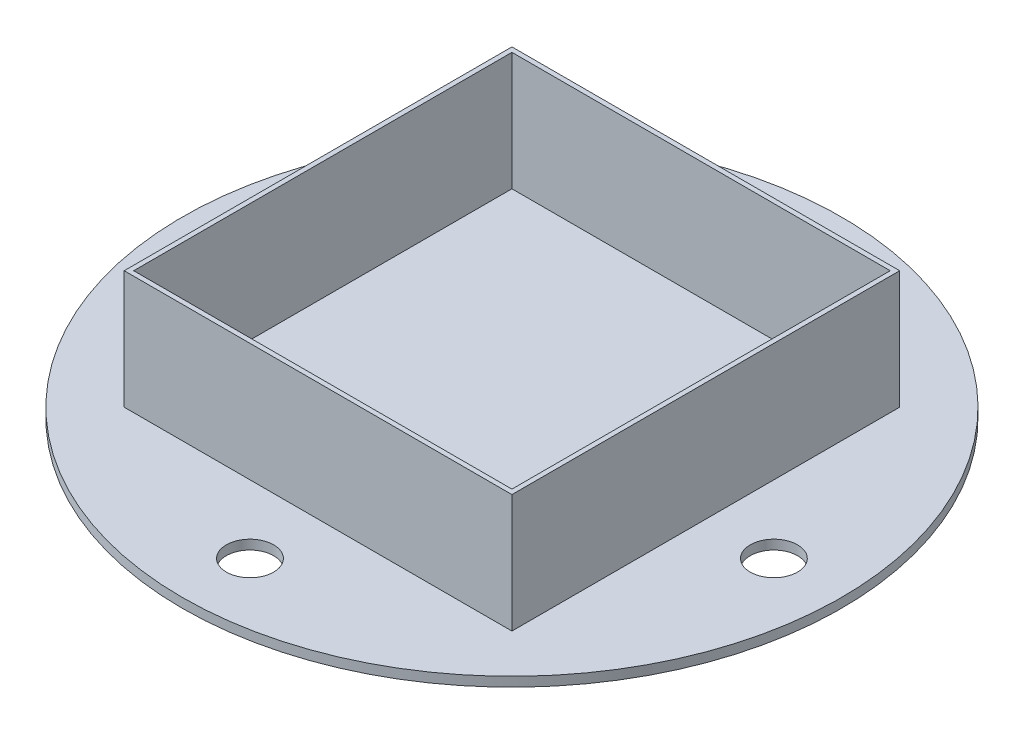
ISO-10303-21;
HEADER;
FILE_DESCRIPTION(('STEP AP214'),'2;1');
FILE_NAME('part.step','',(''),(''),'','','');
FILE_SCHEMA(('AUTOMOTIVE_DESIGN { 1 0 10303 214 1 1 1 1 }'));
ENDSEC;
DATA;
#1=APPLICATION_CONTEXT('core data for automotive mechanical design processes');
#2=APPLICATION_PROTOCOL_DEFINITION('international standard','automotive_design',2000,#1);
#3=PRODUCT_CONTEXT('',#1,'mechanical');
#4=PRODUCT('Part','Part','',(#3));
#5=PRODUCT_RELATED_PRODUCT_CATEGORY('part','',(#4));
#6=PRODUCT_DEFINITION_FORMATION('','',#4);
#7=PRODUCT_DEFINITION_CONTEXT('part definition',#1,'design');
#8=PRODUCT_DEFINITION('design','',#6,#7);
#9=PRODUCT_DEFINITION_SHAPE('','',#8);
#10=(LENGTH_UNIT() NAMED_UNIT(*) SI_UNIT(.MILLI.,.METRE.));
#11=(NAMED_UNIT(*) PLANE_ANGLE_UNIT() SI_UNIT($,.RADIAN.));
#12=(NAMED_UNIT(*) SI_UNIT($,.STERADIAN.) SOLID_ANGLE_UNIT());
#13=UNCERTAINTY_MEASURE_WITH_UNIT(LENGTH_MEASURE(1.E-05),#10,'distance_accuracy_value','');
#14=(GEOMETRIC_REPRESENTATION_CONTEXT(3) GLOBAL_UNCERTAINTY_ASSIGNED_CONTEXT((#13)) GLOBAL_UNIT_ASSIGNED_CONTEXT((#10,
#11,#12)) REPRESENTATION_CONTEXT('',''));
#15=CARTESIAN_POINT('',(0.,0.,0.));
#16=DIRECTION('',(0.,0.,1.));
#17=DIRECTION('',(1.,0.,0.));
#18=AXIS2_PLACEMENT_3D('',#15,#16,#17);
#19=CARTESIAN_POINT('',(0.,2.54,0.));
#20=DIRECTION('',(0.,1.,0.));
#21=DIRECTION('',(0.,0.,1.));
#22=AXIS2_PLACEMENT_3D('',#19,#20,#21);
#23=PLANE('',#22);
#24=CARTESIAN_POINT('',(0.,2.54,-70.4215));
#25=DIRECTION('',(0.,1.,0.));
#26=DIRECTION('',(0.,0.,1.));
#27=AXIS2_PLACEMENT_3D('',#24,#25,#26);
#28=CIRCLE('',#27,6.35);
#29=CARTESIAN_POINT('',(0.,2.54,-64.0715));
#30=VERTEX_POINT('',#29);
#31=EDGE_CURVE('E379',#30,#30,#28,.T.);
#32=ORIENTED_EDGE('',*,*,#31,.F.);
#33=EDGE_LOOP('',(#32));
#34=FACE_BOUND('',#33,.T.);
#35=CARTESIAN_POINT('',(0.,2.54,70.358));
#36=DIRECTION('',(0.,1.,0.));
#37=DIRECTION('',(0.,0.,1.));
#38=AXIS2_PLACEMENT_3D('',#35,#36,#37);
#39=CIRCLE('',#38,6.35);
#40=CARTESIAN_POINT('',(0.,2.54,76.708));
#41=VERTEX_POINT('',#40);
#42=EDGE_CURVE('E381',#41,#41,#39,.T.);
#43=ORIENTED_EDGE('',*,*,#42,.F.);
#44=EDGE_LOOP('',(#43));
#45=FACE_BOUND('',#44,.T.);
#46=CARTESIAN_POINT('',(70.358,2.54,0.));
#47=DIRECTION('',(0.,1.,0.));
#48=DIRECTION('',(0.,0.,1.));
#49=AXIS2_PLACEMENT_3D('',#46,#47,#48);
#50=CIRCLE('',#49,6.35);
#51=CARTESIAN_POINT('',(70.358,2.54,6.35));
#52=VERTEX_POINT('',#51);
#53=EDGE_CURVE('E393',#52,#52,#50,.T.);
#54=ORIENTED_EDGE('',*,*,#53,.F.);
#55=EDGE_LOOP('',(#54));
#56=FACE_BOUND('',#55,.T.);
#57=CARTESIAN_POINT('',(-70.358,2.54,0.));
#58=DIRECTION('',(0.,1.,0.));
#59=DIRECTION('',(0.,0.,1.));
#60=AXIS2_PLACEMENT_3D('',#57,#58,#59);
#61=CIRCLE('',#60,6.35);
#62=CARTESIAN_POINT('',(-70.358,2.54,6.35));
#63=VERTEX_POINT('',#62);
#64=EDGE_CURVE('E401',#63,#63,#61,.T.);
#65=ORIENTED_EDGE('',*,*,#64,.F.);
#66=EDGE_LOOP('',(#65));
#67=FACE_BOUND('',#66,.T.);
#68=CARTESIAN_POINT('',(0.,2.54,0.));
#69=DIRECTION('',(0.,1.,0.));
#70=DIRECTION('',(0.,0.,1.));
#71=AXIS2_PLACEMENT_3D('',#68,#69,#70);
#72=CIRCLE('',#71,88.519);
#73=CARTESIAN_POINT('',(0.,2.54,88.519));
#74=VERTEX_POINT('',#73);
#75=EDGE_CURVE('E12',#74,#74,#72,.T.);
#76=ORIENTED_EDGE('',*,*,#75,.T.);
#77=EDGE_LOOP('',(#76));
#78=FACE_BOUND('',#77,.T.);
#79=DIRECTION('',(0.,0.,1.));
#80=VECTOR('',#79,1.);
#81=CARTESIAN_POINT('',(52.07,2.54,-52.07));
#82=LINE('',#81,#80);
#83=CARTESIAN_POINT('',(52.07,2.54,-52.07));
#84=VERTEX_POINT('',#83);
#85=CARTESIAN_POINT('',(52.07,2.54,52.07));
#86=VERTEX_POINT('',#85);
#87=EDGE_CURVE('E207',#84,#86,#82,.T.);
#88=ORIENTED_EDGE('',*,*,#87,.T.);
#89=DIRECTION('',(1.,0.,0.));
#90=VECTOR('',#89,1.);
#91=CARTESIAN_POINT('',(-52.07,2.54,52.07));
#92=LINE('',#91,#90);
#93=CARTESIAN_POINT('',(-52.07,2.54,52.07));
#94=VERTEX_POINT('',#93);
#95=EDGE_CURVE('E155',#94,#86,#92,.T.);
#96=ORIENTED_EDGE('',*,*,#95,.F.);
#97=DIRECTION('',(0.,0.,1.));
#98=VECTOR('',#97,1.);
#99=CARTESIAN_POINT('',(-52.07,2.54,-52.07));
#100=LINE('',#99,#98);
#101=CARTESIAN_POINT('',(-52.07,2.54,-52.07));
#102=VERTEX_POINT('',#101);
#103=EDGE_CURVE('E192',#102,#94,#100,.T.);
#104=ORIENTED_EDGE('',*,*,#103,.F.);
#105=DIRECTION('',(1.,0.,0.));
#106=VECTOR('',#105,1.);
#107=CARTESIAN_POINT('',(-52.07,2.54,-52.07));
#108=LINE('',#107,#106);
#109=EDGE_CURVE('E84',#102,#84,#108,.T.);
#110=ORIENTED_EDGE('',*,*,#109,.T.);
#111=EDGE_LOOP('',(#88,#96,#104,#110));
#112=FACE_BOUND('',#111,.T.);
#113=ADVANCED_FACE('F68',(#34,#45,#56,#67,#78,#112),#23,.T.);
#114=CARTESIAN_POINT('',(0.,2.54,0.));
#115=DIRECTION('',(0.,-1.,0.));
#116=DIRECTION('',(0.,0.,-1.));
#117=AXIS2_PLACEMENT_3D('',#114,#115,#116);
#118=CYLINDRICAL_SURFACE('',#117,88.519);
#119=ORIENTED_EDGE('',*,*,#75,.F.);
#120=EDGE_LOOP('',(#119));
#121=FACE_BOUND('',#120,.T.);
#122=CARTESIAN_POINT('',(0.,0.,0.));
#123=DIRECTION('',(0.,1.,0.));
#124=DIRECTION('',(0.,0.,1.));
#125=AXIS2_PLACEMENT_3D('',#122,#123,#124);
#126=CIRCLE('',#125,88.519);
#127=CARTESIAN_POINT('',(0.,0.,88.519));
#128=VERTEX_POINT('',#127);
#129=EDGE_CURVE('E72',#128,#128,#126,.T.);
#130=ORIENTED_EDGE('',*,*,#129,.T.);
#131=EDGE_LOOP('',(#130));
#132=FACE_BOUND('',#131,.T.);
#133=ADVANCED_FACE('F70',(#121,#132),#118,.T.);
#134=CARTESIAN_POINT('',(0.,0.,0.));
#135=DIRECTION('',(0.,1.,0.));
#136=DIRECTION('',(0.,0.,1.));
#137=AXIS2_PLACEMENT_3D('',#134,#135,#136);
#138=PLANE('',#137);
#139=CARTESIAN_POINT('',(0.,0.,-70.4215));
#140=DIRECTION('',(0.,1.,0.));
#141=DIRECTION('',(0.,0.,1.));
#142=AXIS2_PLACEMENT_3D('',#139,#140,#141);
#143=CIRCLE('',#142,6.35);
#144=CARTESIAN_POINT('',(0.,0.,-64.0715));
#145=VERTEX_POINT('',#144);
#146=EDGE_CURVE('E171',#145,#145,#143,.T.);
#147=ORIENTED_EDGE('',*,*,#146,.T.);
#148=EDGE_LOOP('',(#147));
#149=FACE_BOUND('',#148,.T.);
#150=CARTESIAN_POINT('',(0.,0.,70.358));
#151=DIRECTION('',(0.,1.,0.));
#152=DIRECTION('',(0.,0.,1.));
#153=AXIS2_PLACEMENT_3D('',#150,#151,#152);
#154=CIRCLE('',#153,6.35);
#155=CARTESIAN_POINT('',(0.,0.,76.708));
#156=VERTEX_POINT('',#155);
#157=EDGE_CURVE('E387',#156,#156,#154,.T.);
#158=ORIENTED_EDGE('',*,*,#157,.T.);
#159=EDGE_LOOP('',(#158));
#160=FACE_BOUND('',#159,.T.);
#161=CARTESIAN_POINT('',(70.358,0.,0.));
#162=DIRECTION('',(0.,1.,0.));
#163=DIRECTION('',(0.,0.,1.));
#164=AXIS2_PLACEMENT_3D('',#161,#162,#163);
#165=CIRCLE('',#164,6.35);
#166=CARTESIAN_POINT('',(70.358,0.,6.35));
#167=VERTEX_POINT('',#166);
#168=EDGE_CURVE('E397',#167,#167,#165,.T.);
#169=ORIENTED_EDGE('',*,*,#168,.T.);
#170=EDGE_LOOP('',(#169));
#171=FACE_BOUND('',#170,.T.);
#172=CARTESIAN_POINT('',(-70.358,0.,0.));
#173=DIRECTION('',(0.,1.,0.));
#174=DIRECTION('',(0.,0.,1.));
#175=AXIS2_PLACEMENT_3D('',#172,#173,#174);
#176=CIRCLE('',#175,6.35);
#177=CARTESIAN_POINT('',(-70.358,0.,6.35));
#178=VERTEX_POINT('',#177);
#179=EDGE_CURVE('E404',#178,#178,#176,.T.);
#180=ORIENTED_EDGE('',*,*,#179,.T.);
#181=EDGE_LOOP('',(#180));
#182=FACE_BOUND('',#181,.T.);
#183=ORIENTED_EDGE('',*,*,#129,.F.);
#184=EDGE_LOOP('',(#183));
#185=FACE_BOUND('',#184,.T.);
#186=ADVANCED_FACE('F234',(#149,#160,#171,#182,#185),#138,.F.);
#187=CARTESIAN_POINT('',(0.,34.29,0.));
#188=DIRECTION('',(0.,-1.,0.));
#189=DIRECTION('',(0.,0.,-1.));
#190=AXIS2_PLACEMENT_3D('',#187,#188,#189);
#191=PLANE('',#190);
#192=DIRECTION('',(1.,0.,0.));
#193=VECTOR('',#192,1.);
#194=CARTESIAN_POINT('',(-52.07,34.29,52.07));
#195=LINE('',#194,#193);
#196=CARTESIAN_POINT('',(-52.07,34.29,52.07));
#197=VERTEX_POINT('',#196);
#198=CARTESIAN_POINT('',(52.07,34.29,52.07));
#199=VERTEX_POINT('',#198);
#200=EDGE_CURVE('E188',#197,#199,#195,.T.);
#201=ORIENTED_EDGE('',*,*,#200,.T.);
#202=DIRECTION('',(0.,0.,1.));
#203=VECTOR('',#202,1.);
#204=CARTESIAN_POINT('',(52.07,34.29,-52.07));
#205=LINE('',#204,#203);
#206=CARTESIAN_POINT('',(52.07,34.29,-52.07));
#207=VERTEX_POINT('',#206);
#208=EDGE_CURVE('E191',#207,#199,#205,.T.);
#209=ORIENTED_EDGE('',*,*,#208,.F.);
#210=DIRECTION('',(1.,0.,0.));
#211=VECTOR('',#210,1.);
#212=CARTESIAN_POINT('',(-52.07,34.29,-52.07));
#213=LINE('',#212,#211);
#214=CARTESIAN_POINT('',(-52.07,34.29,-52.07));
#215=VERTEX_POINT('',#214);
#216=EDGE_CURVE('E196',#215,#207,#213,.T.);
#217=ORIENTED_EDGE('',*,*,#216,.F.);
#218=DIRECTION('',(0.,0.,1.));
#219=VECTOR('',#218,1.);
#220=CARTESIAN_POINT('',(-52.07,34.29,-52.07));
#221=LINE('',#220,#219);
#222=EDGE_CURVE('E200',#215,#197,#221,.T.);
#223=ORIENTED_EDGE('',*,*,#222,.T.);
#224=EDGE_LOOP('',(#201,#209,#217,#223));
#225=FACE_BOUND('',#224,.T.);
#226=DIRECTION('',(1.,0.,0.));
#227=VECTOR('',#226,1.);
#228=CARTESIAN_POINT('',(-50.8,34.29,50.8));
#229=LINE('',#228,#227);
#230=CARTESIAN_POINT('',(-50.8,34.29,50.8));
#231=VERTEX_POINT('',#230);
#232=CARTESIAN_POINT('',(50.8,34.29,50.8));
#233=VERTEX_POINT('',#232);
#234=EDGE_CURVE('E134',#231,#233,#229,.T.);
#235=ORIENTED_EDGE('',*,*,#234,.F.);
#236=DIRECTION('',(0.,0.,1.));
#237=VECTOR('',#236,1.);
#238=CARTESIAN_POINT('',(-50.8,34.29,-50.8));
#239=LINE('',#238,#237);
#240=CARTESIAN_POINT('',(-50.8,34.29,-50.8));
#241=VERTEX_POINT('',#240);
#242=EDGE_CURVE('E163',#241,#231,#239,.T.);
#243=ORIENTED_EDGE('',*,*,#242,.F.);
#244=DIRECTION('',(1.,0.,0.));
#245=VECTOR('',#244,1.);
#246=CARTESIAN_POINT('',(-50.8,34.29,-50.8));
#247=LINE('',#246,#245);
#248=CARTESIAN_POINT('',(50.8,34.29,-50.8));
#249=VERTEX_POINT('',#248);
#250=EDGE_CURVE('E159',#241,#249,#247,.T.);
#251=ORIENTED_EDGE('',*,*,#250,.T.);
#252=DIRECTION('',(0.,0.,1.));
#253=VECTOR('',#252,1.);
#254=CARTESIAN_POINT('',(50.8,34.29,-50.8));
#255=LINE('',#254,#253);
#256=EDGE_CURVE('E145',#249,#233,#255,.T.);
#257=ORIENTED_EDGE('',*,*,#256,.T.);
#258=EDGE_LOOP('',(#235,#243,#251,#257));
#259=FACE_BOUND('',#258,.T.);
#260=ADVANCED_FACE('F158',(#225,#259),#191,.F.);
#261=CARTESIAN_POINT('',(-52.07,34.29,52.07));
#262=DIRECTION('',(0.,0.,-1.));
#263=DIRECTION('',(-1.,0.,0.));
#264=AXIS2_PLACEMENT_3D('',#261,#262,#263);
#265=PLANE('',#264);
#266=ORIENTED_EDGE('',*,*,#95,.T.);
#267=DIRECTION('',(0.,-1.,0.));
#268=VECTOR('',#267,1.);
#269=CARTESIAN_POINT('',(52.07,34.29,52.07));
#270=LINE('',#269,#268);
#271=EDGE_CURVE('E224',#199,#86,#270,.T.);
#272=ORIENTED_EDGE('',*,*,#271,.F.);
#273=ORIENTED_EDGE('',*,*,#200,.F.);
#274=DIRECTION('',(0.,-1.,0.));
#275=VECTOR('',#274,1.);
#276=CARTESIAN_POINT('',(-52.07,34.29,52.07));
#277=LINE('',#276,#275);
#278=EDGE_CURVE('E203',#197,#94,#277,.T.);
#279=ORIENTED_EDGE('',*,*,#278,.T.);
#280=EDGE_LOOP('',(#266,#272,#273,#279));
#281=FACE_BOUND('',#280,.T.);
#282=ADVANCED_FACE('F242',(#281),#265,.F.);
#283=CARTESIAN_POINT('',(52.07,34.29,-52.07));
#284=DIRECTION('',(1.,0.,0.));
#285=DIRECTION('',(0.,0.,-1.));
#286=AXIS2_PLACEMENT_3D('',#283,#284,#285);
#287=PLANE('',#286);
#288=ORIENTED_EDGE('',*,*,#87,.F.);
#289=DIRECTION('',(0.,-1.,0.));
#290=VECTOR('',#289,1.);
#291=CARTESIAN_POINT('',(52.07,34.29,-52.07));
#292=LINE('',#291,#290);
#293=EDGE_CURVE('E221',#207,#84,#292,.T.);
#294=ORIENTED_EDGE('',*,*,#293,.F.);
#295=ORIENTED_EDGE('',*,*,#208,.T.);
#296=ORIENTED_EDGE('',*,*,#271,.T.);
#297=EDGE_LOOP('',(#288,#294,#295,#296));
#298=FACE_BOUND('',#297,.T.);
#299=ADVANCED_FACE('F288',(#298),#287,.T.);
#300=CARTESIAN_POINT('',(-52.07,34.29,-52.07));
#301=DIRECTION('',(0.,0.,-1.));
#302=DIRECTION('',(-1.,0.,0.));
#303=AXIS2_PLACEMENT_3D('',#300,#301,#302);
#304=PLANE('',#303);
#305=ORIENTED_EDGE('',*,*,#109,.F.);
#306=DIRECTION('',(0.,-1.,0.));
#307=VECTOR('',#306,1.);
#308=CARTESIAN_POINT('',(-52.07,34.29,-52.07));
#309=LINE('',#308,#307);
#310=EDGE_CURVE('E218',#215,#102,#309,.T.);
#311=ORIENTED_EDGE('',*,*,#310,.F.);
#312=ORIENTED_EDGE('',*,*,#216,.T.);
#313=ORIENTED_EDGE('',*,*,#293,.T.);
#314=EDGE_LOOP('',(#305,#311,#312,#313));
#315=FACE_BOUND('',#314,.T.);
#316=ADVANCED_FACE('F284',(#315),#304,.T.);
#317=CARTESIAN_POINT('',(-52.07,34.29,-52.07));
#318=DIRECTION('',(1.,0.,0.));
#319=DIRECTION('',(0.,0.,-1.));
#320=AXIS2_PLACEMENT_3D('',#317,#318,#319);
#321=PLANE('',#320);
#322=ORIENTED_EDGE('',*,*,#103,.T.);
#323=ORIENTED_EDGE('',*,*,#278,.F.);
#324=ORIENTED_EDGE('',*,*,#222,.F.);
#325=ORIENTED_EDGE('',*,*,#310,.T.);
#326=EDGE_LOOP('',(#322,#323,#324,#325));
#327=FACE_BOUND('',#326,.T.);
#328=ADVANCED_FACE('F280',(#327),#321,.F.);
#329=CARTESIAN_POINT('',(-50.8,34.29,50.8));
#330=DIRECTION('',(0.,0.,-1.));
#331=DIRECTION('',(-1.,0.,0.));
#332=AXIS2_PLACEMENT_3D('',#329,#330,#331);
#333=PLANE('',#332);
#334=DIRECTION('',(1.,0.,0.));
#335=VECTOR('',#334,1.);
#336=CARTESIAN_POINT('',(-50.8,2.54,50.8));
#337=LINE('',#336,#335);
#338=CARTESIAN_POINT('',(-50.8,2.54,50.8));
#339=VERTEX_POINT('',#338);
#340=CARTESIAN_POINT('',(50.8,2.54,50.8));
#341=VERTEX_POINT('',#340);
#342=EDGE_CURVE('E92',#339,#341,#337,.T.);
#343=ORIENTED_EDGE('',*,*,#342,.F.);
#344=DIRECTION('',(0.,-1.,0.));
#345=VECTOR('',#344,1.);
#346=CARTESIAN_POINT('',(-50.8,34.29,50.8));
#347=LINE('',#346,#345);
#348=EDGE_CURVE('E140',#231,#339,#347,.T.);
#349=ORIENTED_EDGE('',*,*,#348,.F.);
#350=ORIENTED_EDGE('',*,*,#234,.T.);
#351=DIRECTION('',(0.,-1.,0.));
#352=VECTOR('',#351,1.);
#353=CARTESIAN_POINT('',(50.8,34.29,50.8));
#354=LINE('',#353,#352);
#355=EDGE_CURVE('E137',#233,#341,#354,.T.);
#356=ORIENTED_EDGE('',*,*,#355,.T.);
#357=EDGE_LOOP('',(#343,#349,#350,#356));
#358=FACE_BOUND('',#357,.T.);
#359=ADVANCED_FACE('F136',(#358),#333,.T.);
#360=CARTESIAN_POINT('',(50.8,34.29,-50.8));
#361=DIRECTION('',(1.,0.,0.));
#362=DIRECTION('',(0.,0.,-1.));
#363=AXIS2_PLACEMENT_3D('',#360,#361,#362);
#364=PLANE('',#363);
#365=DIRECTION('',(0.,0.,1.));
#366=VECTOR('',#365,1.);
#367=CARTESIAN_POINT('',(50.8,2.54,-50.8));
#368=LINE('',#367,#366);
#369=CARTESIAN_POINT('',(50.8,2.54,-50.8));
#370=VERTEX_POINT('',#369);
#371=EDGE_CURVE('E153',#370,#341,#368,.T.);
#372=ORIENTED_EDGE('',*,*,#371,.T.);
#373=ORIENTED_EDGE('',*,*,#355,.F.);
#374=ORIENTED_EDGE('',*,*,#256,.F.);
#375=DIRECTION('',(0.,-1.,0.));
#376=VECTOR('',#375,1.);
#377=CARTESIAN_POINT('',(50.8,34.29,-50.8));
#378=LINE('',#377,#376);
#379=EDGE_CURVE('E156',#249,#370,#378,.T.);
#380=ORIENTED_EDGE('',*,*,#379,.T.);
#381=EDGE_LOOP('',(#372,#373,#374,#380));
#382=FACE_BOUND('',#381,.T.);
#383=ADVANCED_FACE('F150',(#382),#364,.F.);
#384=CARTESIAN_POINT('',(-50.8,34.29,-50.8));
#385=DIRECTION('',(0.,0.,-1.));
#386=DIRECTION('',(-1.,0.,0.));
#387=AXIS2_PLACEMENT_3D('',#384,#385,#386);
#388=PLANE('',#387);
#389=DIRECTION('',(1.,0.,0.));
#390=VECTOR('',#389,1.);
#391=CARTESIAN_POINT('',(-50.8,2.54,-50.8));
#392=LINE('',#391,#390);
#393=CARTESIAN_POINT('',(-50.8,2.54,-50.8));
#394=VERTEX_POINT('',#393);
#395=EDGE_CURVE('E174',#394,#370,#392,.T.);
#396=ORIENTED_EDGE('',*,*,#395,.T.);
#397=ORIENTED_EDGE('',*,*,#379,.F.);
#398=ORIENTED_EDGE('',*,*,#250,.F.);
#399=DIRECTION('',(0.,-1.,0.));
#400=VECTOR('',#399,1.);
#401=CARTESIAN_POINT('',(-50.8,34.29,-50.8));
#402=LINE('',#401,#400);
#403=EDGE_CURVE('E182',#241,#394,#402,.T.);
#404=ORIENTED_EDGE('',*,*,#403,.T.);
#405=EDGE_LOOP('',(#396,#397,#398,#404));
#406=FACE_BOUND('',#405,.T.);
#407=ADVANCED_FACE('F266',(#406),#388,.F.);
#408=CARTESIAN_POINT('',(-50.8,34.29,-50.8));
#409=DIRECTION('',(1.,0.,0.));
#410=DIRECTION('',(0.,0.,-1.));
#411=AXIS2_PLACEMENT_3D('',#408,#409,#410);
#412=PLANE('',#411);
#413=DIRECTION('',(0.,0.,1.));
#414=VECTOR('',#413,1.);
#415=CARTESIAN_POINT('',(-50.8,2.54,-50.8));
#416=LINE('',#415,#414);
#417=EDGE_CURVE('E146',#394,#339,#416,.T.);
#418=ORIENTED_EDGE('',*,*,#417,.F.);
#419=ORIENTED_EDGE('',*,*,#403,.F.);
#420=ORIENTED_EDGE('',*,*,#242,.T.);
#421=ORIENTED_EDGE('',*,*,#348,.T.);
#422=EDGE_LOOP('',(#418,#419,#420,#421));
#423=FACE_BOUND('',#422,.T.);
#424=ADVANCED_FACE('F259',(#423),#412,.T.);
#425=ORIENTED_EDGE('',*,*,#342,.T.);
#426=ORIENTED_EDGE('',*,*,#371,.F.);
#427=ORIENTED_EDGE('',*,*,#395,.F.);
#428=ORIENTED_EDGE('',*,*,#417,.T.);
#429=EDGE_LOOP('',(#425,#426,#427,#428));
#430=FACE_BOUND('',#429,.T.);
#431=ADVANCED_FACE('F251',(#430),#23,.T.);
#432=CARTESIAN_POINT('',(-70.358,0.,0.));
#433=DIRECTION('',(0.,1.,0.));
#434=DIRECTION('',(0.,0.,1.));
#435=AXIS2_PLACEMENT_3D('',#432,#433,#434);
#436=CYLINDRICAL_SURFACE('',#435,6.35);
#437=ORIENTED_EDGE('',*,*,#179,.F.);
#438=EDGE_LOOP('',(#437));
#439=FACE_BOUND('',#438,.T.);
#440=ORIENTED_EDGE('',*,*,#64,.T.);
#441=EDGE_LOOP('',(#440));
#442=FACE_BOUND('',#441,.T.);
#443=ADVANCED_FACE('F258',(#439,#442),#436,.F.);
#444=CARTESIAN_POINT('',(70.358,0.,0.));
#445=DIRECTION('',(0.,1.,0.));
#446=DIRECTION('',(0.,0.,1.));
#447=AXIS2_PLACEMENT_3D('',#444,#445,#446);
#448=CYLINDRICAL_SURFACE('',#447,6.35);
#449=ORIENTED_EDGE('',*,*,#168,.F.);
#450=EDGE_LOOP('',(#449));
#451=FACE_BOUND('',#450,.T.);
#452=ORIENTED_EDGE('',*,*,#53,.T.);
#453=EDGE_LOOP('',(#452));
#454=FACE_BOUND('',#453,.T.);
#455=ADVANCED_FACE('F263',(#451,#454),#448,.F.);
#456=CARTESIAN_POINT('',(0.,0.,70.358));
#457=DIRECTION('',(0.,1.,0.));
#458=DIRECTION('',(0.,0.,1.));
#459=AXIS2_PLACEMENT_3D('',#456,#457,#458);
#460=CYLINDRICAL_SURFACE('',#459,6.35);
#461=ORIENTED_EDGE('',*,*,#157,.F.);
#462=EDGE_LOOP('',(#461));
#463=FACE_BOUND('',#462,.T.);
#464=ORIENTED_EDGE('',*,*,#42,.T.);
#465=EDGE_LOOP('',(#464));
#466=FACE_BOUND('',#465,.T.);
#467=ADVANCED_FACE('F354',(#463,#466),#460,.F.);
#468=CARTESIAN_POINT('',(0.,0.,-70.4215));
#469=DIRECTION('',(0.,1.,0.));
#470=DIRECTION('',(0.,0.,1.));
#471=AXIS2_PLACEMENT_3D('',#468,#469,#470);
#472=CYLINDRICAL_SURFACE('',#471,6.35);
#473=ORIENTED_EDGE('',*,*,#146,.F.);
#474=EDGE_LOOP('',(#473));
#475=FACE_BOUND('',#474,.T.);
#476=ORIENTED_EDGE('',*,*,#31,.T.);
#477=EDGE_LOOP('',(#476));
#478=FACE_BOUND('',#477,.T.);
#479=ADVANCED_FACE('F363',(#475,#478),#472,.F.);
#480=CLOSED_SHELL('',(#113,#133,#186,#260,#282,#299,#316,#328,#359,#383,#407,#424,#431,#443,
#455,#467,#479));
#481=MANIFOLD_SOLID_BREP('B2',#480);
#482=ADVANCED_BREP_SHAPE_REPRESENTATION('',(#18,#481),#14);
#483=SHAPE_DEFINITION_REPRESENTATION(#9,#482);
ENDSEC;
END-ISO-10303-21;
